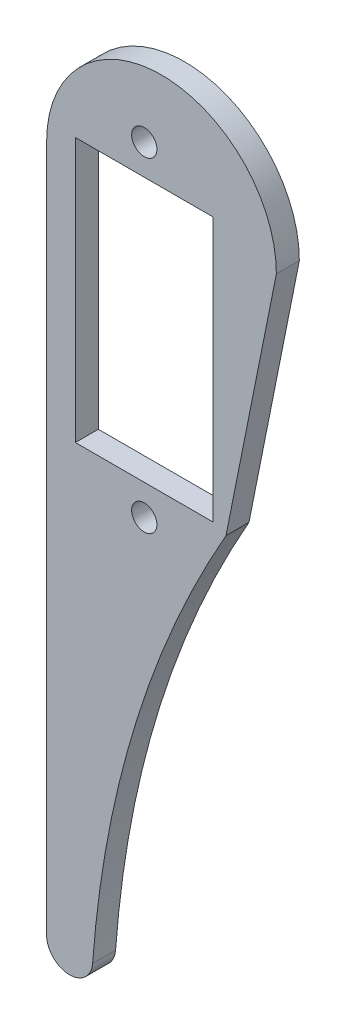
ISO-10303-21;
HEADER;
FILE_DESCRIPTION(('STEP AP214'),'2;1');
FILE_NAME('part.step','',(''),(''),'','','');
FILE_SCHEMA(('AUTOMOTIVE_DESIGN { 1 0 10303 214 1 1 1 1 }'));
ENDSEC;
DATA;
#1=APPLICATION_CONTEXT('core data for automotive mechanical design processes');
#2=APPLICATION_PROTOCOL_DEFINITION('international standard','automotive_design',2000,#1);
#3=PRODUCT_CONTEXT('',#1,'mechanical');
#4=PRODUCT('Part','Part','',(#3));
#5=PRODUCT_RELATED_PRODUCT_CATEGORY('part','',(#4));
#6=PRODUCT_DEFINITION_FORMATION('','',#4);
#7=PRODUCT_DEFINITION_CONTEXT('part definition',#1,'design');
#8=PRODUCT_DEFINITION('design','',#6,#7);
#9=PRODUCT_DEFINITION_SHAPE('','',#8);
#10=(LENGTH_UNIT() NAMED_UNIT(*) SI_UNIT(.MILLI.,.METRE.));
#11=(NAMED_UNIT(*) PLANE_ANGLE_UNIT() SI_UNIT($,.RADIAN.));
#12=(NAMED_UNIT(*) SI_UNIT($,.STERADIAN.) SOLID_ANGLE_UNIT());
#13=UNCERTAINTY_MEASURE_WITH_UNIT(LENGTH_MEASURE(1.E-05),#10,'distance_accuracy_value','');
#14=(GEOMETRIC_REPRESENTATION_CONTEXT(3) GLOBAL_UNCERTAINTY_ASSIGNED_CONTEXT((#13)) GLOBAL_UNIT_ASSIGNED_CONTEXT((#10,
#11,#12)) REPRESENTATION_CONTEXT('',''));
#15=CARTESIAN_POINT('',(0.,0.,0.));
#16=DIRECTION('',(0.,0.,1.));
#17=DIRECTION('',(1.,0.,0.));
#18=AXIS2_PLACEMENT_3D('',#15,#16,#17);
#19=CARTESIAN_POINT('',(8.21630615640599,2.32945091514143,2.));
#20=DIRECTION('',(0.,0.,-1.));
#21=DIRECTION('',(-1.,0.,0.));
#22=AXIS2_PLACEMENT_3D('',#19,#20,#21);
#23=CYLINDRICAL_SURFACE('',#22,10.);
#24=CARTESIAN_POINT('',(8.21630615640599,2.32945091514143,0.));
#25=DIRECTION('',(0.,0.,1.));
#26=DIRECTION('',(-1.,0.,0.));
#27=AXIS2_PLACEMENT_3D('',#24,#25,#26);
#28=CIRCLE('',#27,10.);
#29=CARTESIAN_POINT('',(18.216306156406,2.32945091514143,0.));
#30=VERTEX_POINT('',#29);
#31=CARTESIAN_POINT('',(-1.78369384359401,2.32945091514143,0.));
#32=VERTEX_POINT('',#31);
#33=EDGE_CURVE('E117',#30,#32,#28,.T.);
#34=ORIENTED_EDGE('',*,*,#33,.T.);
#35=DIRECTION('',(0.,0.,-1.));
#36=VECTOR('',#35,1.);
#37=CARTESIAN_POINT('',(-1.78369384359401,2.32945091514143,2.));
#38=LINE('',#37,#36);
#39=CARTESIAN_POINT('',(-1.78369384359401,2.32945091514143,2.));
#40=VERTEX_POINT('',#39);
#41=EDGE_CURVE('E11',#40,#32,#38,.T.);
#42=ORIENTED_EDGE('',*,*,#41,.F.);
#43=CARTESIAN_POINT('',(8.21630615640599,2.32945091514143,2.));
#44=DIRECTION('',(0.,0.,1.));
#45=DIRECTION('',(-1.,0.,0.));
#46=AXIS2_PLACEMENT_3D('',#43,#44,#45);
#47=CIRCLE('',#46,10.);
#48=CARTESIAN_POINT('',(18.216306156406,2.32945091514143,2.));
#49=VERTEX_POINT('',#48);
#50=EDGE_CURVE('E156',#49,#40,#47,.T.);
#51=ORIENTED_EDGE('',*,*,#50,.F.);
#52=DIRECTION('',(0.,0.,-1.));
#53=VECTOR('',#52,1.);
#54=CARTESIAN_POINT('',(18.216306156406,2.32945091514143,2.));
#55=LINE('',#54,#53);
#56=EDGE_CURVE('E226',#49,#30,#55,.T.);
#57=ORIENTED_EDGE('',*,*,#56,.T.);
#58=EDGE_LOOP('',(#34,#42,#51,#57));
#59=FACE_BOUND('',#58,.T.);
#60=ADVANCED_FACE('F39',(#59),#23,.T.);
#61=CARTESIAN_POINT('',(-1.78369384359401,2.32945091514143,2.));
#62=DIRECTION('',(1.,0.,0.));
#63=DIRECTION('',(0.,1.,0.));
#64=AXIS2_PLACEMENT_3D('',#61,#62,#63);
#65=PLANE('',#64);
#66=DIRECTION('',(0.,-1.,0.));
#67=VECTOR('',#66,1.);
#68=CARTESIAN_POINT('',(-1.78369384359401,2.32945091514143,0.));
#69=LINE('',#68,#67);
#70=CARTESIAN_POINT('',(-1.783693843594,-57.6705490848586,0.));
#71=VERTEX_POINT('',#70);
#72=EDGE_CURVE('E197',#32,#71,#69,.T.);
#73=ORIENTED_EDGE('',*,*,#72,.T.);
#74=DIRECTION('',(0.,0.,-1.));
#75=VECTOR('',#74,1.);
#76=CARTESIAN_POINT('',(-1.783693843594,-57.6705490848586,2.));
#77=LINE('',#76,#75);
#78=CARTESIAN_POINT('',(-1.783693843594,-57.6705490848586,2.));
#79=VERTEX_POINT('',#78);
#80=EDGE_CURVE('E47',#79,#71,#77,.T.);
#81=ORIENTED_EDGE('',*,*,#80,.F.);
#82=DIRECTION('',(0.,-1.,0.));
#83=VECTOR('',#82,1.);
#84=CARTESIAN_POINT('',(-1.78369384359401,2.32945091514143,2.));
#85=LINE('',#84,#83);
#86=EDGE_CURVE('E160',#40,#79,#85,.T.);
#87=ORIENTED_EDGE('',*,*,#86,.F.);
#88=ORIENTED_EDGE('',*,*,#41,.T.);
#89=EDGE_LOOP('',(#73,#81,#87,#88));
#90=FACE_BOUND('',#89,.T.);
#91=ADVANCED_FACE('F188',(#90),#65,.F.);
#92=CARTESIAN_POINT('',(0.216306156405997,-57.5217745207678,2.));
#93=DIRECTION('',(0.,0.,-1.));
#94=DIRECTION('',(-1.,0.,0.));
#95=AXIS2_PLACEMENT_3D('',#92,#93,#94);
#96=CYLINDRICAL_SURFACE('',#95,2.0055258340197);
#97=CARTESIAN_POINT('',(0.216306156405997,-57.5217745207678,0.));
#98=DIRECTION('',(0.,0.,1.));
#99=DIRECTION('',(-1.,0.,0.));
#100=AXIS2_PLACEMENT_3D('',#97,#98,#99);
#101=CIRCLE('',#100,2.0055258340197);
#102=CARTESIAN_POINT('',(2.216306156406,-57.6705490848586,0.));
#103=VERTEX_POINT('',#102);
#104=EDGE_CURVE('E205',#71,#103,#101,.T.);
#105=ORIENTED_EDGE('',*,*,#104,.T.);
#106=DIRECTION('',(0.,0.,-1.));
#107=VECTOR('',#106,1.);
#108=CARTESIAN_POINT('',(2.216306156406,-57.6705490848586,2.));
#109=LINE('',#108,#107);
#110=CARTESIAN_POINT('',(2.216306156406,-57.6705490848586,2.));
#111=VERTEX_POINT('',#110);
#112=EDGE_CURVE('E210',#111,#103,#109,.T.);
#113=ORIENTED_EDGE('',*,*,#112,.F.);
#114=CARTESIAN_POINT('',(0.216306156405997,-57.5217745207678,2.));
#115=DIRECTION('',(0.,0.,1.));
#116=DIRECTION('',(-1.,0.,0.));
#117=AXIS2_PLACEMENT_3D('',#114,#115,#116);
#118=CIRCLE('',#117,2.0055258340197);
#119=EDGE_CURVE('E164',#79,#111,#118,.T.);
#120=ORIENTED_EDGE('',*,*,#119,.F.);
#121=ORIENTED_EDGE('',*,*,#80,.T.);
#122=EDGE_LOOP('',(#105,#113,#120,#121));
#123=FACE_BOUND('',#122,.T.);
#124=ADVANCED_FACE('F184',(#123),#96,.T.);
#125=CARTESIAN_POINT('',(2.216306156406,-57.6705490848586,2.));
#126=CARTESIAN_POINT('',(3.2265957531882,-44.089066215707,2.));
#127=CARTESIAN_POINT('',(7.09762636747385,-31.4005798109446,2.));
#128=CARTESIAN_POINT('',(13.8293979992635,-19.6050898705712,2.));
#129=B_SPLINE_CURVE_WITH_KNOTS('',3,(#125,#126,#127,#128),.UNSPECIFIED.,.F.,.F.,(4,4),(0.,1.),.UNSPECIFIED.);
#130=DIRECTION('',(0.,0.,-1.));
#131=VECTOR('',#130,1.);
#132=SURFACE_OF_LINEAR_EXTRUSION('',#129,#131);
#133=CARTESIAN_POINT('',(2.216306156406,-57.6705490848586,0.));
#134=CARTESIAN_POINT('',(3.2265957531882,-44.089066215707,0.));
#135=CARTESIAN_POINT('',(7.09762636747385,-31.4005798109446,0.));
#136=CARTESIAN_POINT('',(13.8293979992635,-19.6050898705712,0.));
#137=B_SPLINE_CURVE_WITH_KNOTS('',3,(#133,#134,#135,#136),.UNSPECIFIED.,.F.,.F.,(4,4),(0.,1.),.UNSPECIFIED.);
#138=CARTESIAN_POINT('',(13.8293979992635,-19.6050898705712,0.));
#139=VERTEX_POINT('',#138);
#140=EDGE_CURVE('E213',#103,#139,#137,.T.);
#141=ORIENTED_EDGE('',*,*,#140,.T.);
#142=DIRECTION('',(0.,0.,-1.));
#143=VECTOR('',#142,1.);
#144=CARTESIAN_POINT('',(13.8293979992635,-19.6050898705712,2.));
#145=LINE('',#144,#143);
#146=CARTESIAN_POINT('',(13.8293979992635,-19.6050898705712,2.));
#147=VERTEX_POINT('',#146);
#148=EDGE_CURVE('E230',#147,#139,#145,.T.);
#149=ORIENTED_EDGE('',*,*,#148,.F.);
#150=EDGE_CURVE('E167',#111,#147,#129,.T.);
#151=ORIENTED_EDGE('',*,*,#150,.F.);
#152=ORIENTED_EDGE('',*,*,#112,.T.);
#153=EDGE_LOOP('',(#141,#149,#151,#152));
#154=FACE_BOUND('',#153,.T.);
#155=ADVANCED_FACE('F179',(#154),#132,.F.);
#156=CARTESIAN_POINT('',(18.216306156406,2.32945091514143,2.));
#157=DIRECTION('',(-0.98058067569092,0.196116135138184,0.));
#158=DIRECTION('',(-0.196116135138184,-0.98058067569092,0.));
#159=AXIS2_PLACEMENT_3D('',#156,#157,#158);
#160=PLANE('',#159);
#161=DIRECTION('',(0.196116135138184,0.98058067569092,0.));
#162=VECTOR('',#161,1.);
#163=CARTESIAN_POINT('',(18.216306156406,2.32945091514143,0.));
#164=LINE('',#163,#162);
#165=EDGE_CURVE('E161',#139,#30,#164,.T.);
#166=ORIENTED_EDGE('',*,*,#165,.T.);
#167=ORIENTED_EDGE('',*,*,#56,.F.);
#168=DIRECTION('',(0.196116135138184,0.98058067569092,0.));
#169=VECTOR('',#168,1.);
#170=CARTESIAN_POINT('',(18.216306156406,2.32945091514143,2.));
#171=LINE('',#170,#169);
#172=EDGE_CURVE('E173',#147,#49,#171,.T.);
#173=ORIENTED_EDGE('',*,*,#172,.F.);
#174=ORIENTED_EDGE('',*,*,#148,.T.);
#175=EDGE_LOOP('',(#166,#167,#173,#174));
#176=FACE_BOUND('',#175,.T.);
#177=ADVANCED_FACE('F183',(#176),#160,.F.);
#178=CARTESIAN_POINT('',(8.21630615640599,2.32945091514143,2.));
#179=DIRECTION('',(0.,0.,-1.));
#180=DIRECTION('',(-1.,0.,0.));
#181=AXIS2_PLACEMENT_3D('',#178,#179,#180);
#182=PLANE('',#181);
#183=CARTESIAN_POINT('',(6.716306156406,-21.7893999918604,2.));
#184=DIRECTION('',(0.,0.,1.));
#185=DIRECTION('',(1.,0.,0.));
#186=AXIS2_PLACEMENT_3D('',#183,#184,#185);
#187=CIRCLE('',#186,1.1);
#188=CARTESIAN_POINT('',(7.81630615640599,-21.7893999918604,2.));
#189=VERTEX_POINT('',#188);
#190=EDGE_CURVE('E290',#189,#189,#187,.T.);
#191=ORIENTED_EDGE('',*,*,#190,.F.);
#192=EDGE_LOOP('',(#191));
#193=FACE_BOUND('',#192,.T.);
#194=CARTESIAN_POINT('',(6.71630615640599,6.51060000813964,2.));
#195=DIRECTION('',(0.,0.,1.));
#196=DIRECTION('',(1.,0.,0.));
#197=AXIS2_PLACEMENT_3D('',#194,#195,#196);
#198=CIRCLE('',#197,1.1);
#199=CARTESIAN_POINT('',(7.81630615640599,6.51060000813964,2.));
#200=VERTEX_POINT('',#199);
#201=EDGE_CURVE('E285',#200,#200,#198,.T.);
#202=ORIENTED_EDGE('',*,*,#201,.F.);
#203=EDGE_LOOP('',(#202));
#204=FACE_BOUND('',#203,.T.);
#205=DIRECTION('',(1.,0.,0.));
#206=VECTOR('',#205,1.);
#207=CARTESIAN_POINT('',(0.716306156405993,-19.1393999918604,2.));
#208=LINE('',#207,#206);
#209=CARTESIAN_POINT('',(0.716306156405992,-19.1393999918604,2.));
#210=VERTEX_POINT('',#209);
#211=CARTESIAN_POINT('',(12.716306156406,-19.1393999918604,2.));
#212=VERTEX_POINT('',#211);
#213=EDGE_CURVE('E134',#210,#212,#208,.T.);
#214=ORIENTED_EDGE('',*,*,#213,.F.);
#215=DIRECTION('',(0.,-1.,0.));
#216=VECTOR('',#215,1.);
#217=CARTESIAN_POINT('',(0.71630615640599,3.86060000813964,2.));
#218=LINE('',#217,#216);
#219=CARTESIAN_POINT('',(0.71630615640599,3.86060000813964,2.));
#220=VERTEX_POINT('',#219);
#221=EDGE_CURVE('E54',#220,#210,#218,.T.);
#222=ORIENTED_EDGE('',*,*,#221,.F.);
#223=DIRECTION('',(-1.,0.,0.));
#224=VECTOR('',#223,1.);
#225=CARTESIAN_POINT('',(0.71630615640599,3.86060000813964,2.));
#226=LINE('',#225,#224);
#227=CARTESIAN_POINT('',(12.716306156406,3.86060000813964,2.));
#228=VERTEX_POINT('',#227);
#229=EDGE_CURVE('E124',#228,#220,#226,.T.);
#230=ORIENTED_EDGE('',*,*,#229,.F.);
#231=DIRECTION('',(0.,1.,0.));
#232=VECTOR('',#231,1.);
#233=CARTESIAN_POINT('',(12.716306156406,3.86060000813964,2.));
#234=LINE('',#233,#232);
#235=EDGE_CURVE('E142',#212,#228,#234,.T.);
#236=ORIENTED_EDGE('',*,*,#235,.F.);
#237=EDGE_LOOP('',(#214,#222,#230,#236));
#238=FACE_BOUND('',#237,.T.);
#239=ORIENTED_EDGE('',*,*,#50,.T.);
#240=ORIENTED_EDGE('',*,*,#86,.T.);
#241=ORIENTED_EDGE('',*,*,#119,.T.);
#242=ORIENTED_EDGE('',*,*,#150,.T.);
#243=ORIENTED_EDGE('',*,*,#172,.T.);
#244=EDGE_LOOP('',(#239,#240,#241,#242,#243));
#245=FACE_BOUND('',#244,.T.);
#246=ADVANCED_FACE('F239',(#193,#204,#238,#245),#182,.F.);
#247=CARTESIAN_POINT('',(8.21630615640599,2.32945091514143,0.));
#248=DIRECTION('',(0.,0.,-1.));
#249=DIRECTION('',(-1.,0.,0.));
#250=AXIS2_PLACEMENT_3D('',#247,#248,#249);
#251=PLANE('',#250);
#252=CARTESIAN_POINT('',(6.716306156406,-21.7893999918604,0.));
#253=DIRECTION('',(0.,0.,-1.));
#254=DIRECTION('',(-1.,0.,0.));
#255=AXIS2_PLACEMENT_3D('',#252,#253,#254);
#256=CIRCLE('',#255,1.1);
#257=CARTESIAN_POINT('',(5.616306156406,-21.7893999918604,0.));
#258=VERTEX_POINT('',#257);
#259=EDGE_CURVE('E296',#258,#258,#256,.F.);
#260=ORIENTED_EDGE('',*,*,#259,.T.);
#261=EDGE_LOOP('',(#260));
#262=FACE_BOUND('',#261,.T.);
#263=CARTESIAN_POINT('',(6.71630615640599,6.51060000813964,0.));
#264=DIRECTION('',(0.,0.,-1.));
#265=DIRECTION('',(-1.,0.,0.));
#266=AXIS2_PLACEMENT_3D('',#263,#264,#265);
#267=CIRCLE('',#266,1.1);
#268=CARTESIAN_POINT('',(5.61630615640599,6.51060000813964,0.));
#269=VERTEX_POINT('',#268);
#270=EDGE_CURVE('E282',#269,#269,#267,.F.);
#271=ORIENTED_EDGE('',*,*,#270,.T.);
#272=EDGE_LOOP('',(#271));
#273=FACE_BOUND('',#272,.T.);
#274=DIRECTION('',(0.,-1.,0.));
#275=VECTOR('',#274,1.);
#276=CARTESIAN_POINT('',(0.71630615640599,3.86060000813964,0.));
#277=LINE('',#276,#275);
#278=CARTESIAN_POINT('',(0.71630615640599,3.86060000813964,0.));
#279=VERTEX_POINT('',#278);
#280=CARTESIAN_POINT('',(0.716306156405993,-19.1393999918604,0.));
#281=VERTEX_POINT('',#280);
#282=EDGE_CURVE('E121',#279,#281,#277,.T.);
#283=ORIENTED_EDGE('',*,*,#282,.T.);
#284=DIRECTION('',(1.,0.,0.));
#285=VECTOR('',#284,1.);
#286=CARTESIAN_POINT('',(0.716306156405993,-19.1393999918604,0.));
#287=LINE('',#286,#285);
#288=CARTESIAN_POINT('',(12.716306156406,-19.1393999918604,0.));
#289=VERTEX_POINT('',#288);
#290=EDGE_CURVE('E109',#281,#289,#287,.T.);
#291=ORIENTED_EDGE('',*,*,#290,.T.);
#292=DIRECTION('',(0.,1.,0.));
#293=VECTOR('',#292,1.);
#294=CARTESIAN_POINT('',(12.716306156406,3.86060000813964,0.));
#295=LINE('',#294,#293);
#296=CARTESIAN_POINT('',(12.716306156406,3.86060000813964,0.));
#297=VERTEX_POINT('',#296);
#298=EDGE_CURVE('E136',#289,#297,#295,.T.);
#299=ORIENTED_EDGE('',*,*,#298,.T.);
#300=DIRECTION('',(-1.,0.,0.));
#301=VECTOR('',#300,1.);
#302=CARTESIAN_POINT('',(0.71630615640599,3.86060000813964,0.));
#303=LINE('',#302,#301);
#304=EDGE_CURVE('E129',#297,#279,#303,.T.);
#305=ORIENTED_EDGE('',*,*,#304,.T.);
#306=EDGE_LOOP('',(#283,#291,#299,#305));
#307=FACE_BOUND('',#306,.T.);
#308=ORIENTED_EDGE('',*,*,#33,.F.);
#309=ORIENTED_EDGE('',*,*,#165,.F.);
#310=ORIENTED_EDGE('',*,*,#140,.F.);
#311=ORIENTED_EDGE('',*,*,#104,.F.);
#312=ORIENTED_EDGE('',*,*,#72,.F.);
#313=EDGE_LOOP('',(#308,#309,#310,#311,#312));
#314=FACE_BOUND('',#313,.T.);
#315=ADVANCED_FACE('F127',(#262,#273,#307,#314),#251,.T.);
#316=CARTESIAN_POINT('',(0.71630615640599,3.86060000813964,-0.00100000000000013));
#317=DIRECTION('',(-1.,0.,0.));
#318=DIRECTION('',(0.,-1.,0.));
#319=AXIS2_PLACEMENT_3D('',#316,#317,#318);
#320=PLANE('',#319);
#321=DIRECTION('',(0.,0.,1.));
#322=VECTOR('',#321,1.);
#323=CARTESIAN_POINT('',(0.71630615640599,3.86060000813964,-0.00100000000000013));
#324=LINE('',#323,#322);
#325=EDGE_CURVE('E118',#279,#220,#324,.T.);
#326=ORIENTED_EDGE('',*,*,#325,.T.);
#327=ORIENTED_EDGE('',*,*,#221,.T.);
#328=DIRECTION('',(0.,0.,1.));
#329=VECTOR('',#328,1.);
#330=CARTESIAN_POINT('',(0.716306156405993,-19.1393999918604,-0.00100000000000013));
#331=LINE('',#330,#329);
#332=EDGE_CURVE('E111',#281,#210,#331,.T.);
#333=ORIENTED_EDGE('',*,*,#332,.F.);
#334=ORIENTED_EDGE('',*,*,#282,.F.);
#335=EDGE_LOOP('',(#326,#327,#333,#334));
#336=FACE_BOUND('',#335,.T.);
#337=ADVANCED_FACE('F120',(#336),#320,.F.);
#338=CARTESIAN_POINT('',(0.71630615640599,3.86060000813964,-0.00100000000000013));
#339=DIRECTION('',(0.,1.,0.));
#340=DIRECTION('',(0.,0.,1.));
#341=AXIS2_PLACEMENT_3D('',#338,#339,#340);
#342=PLANE('',#341);
#343=DIRECTION('',(0.,0.,1.));
#344=VECTOR('',#343,1.);
#345=CARTESIAN_POINT('',(12.716306156406,3.86060000813964,-0.00100000000000013));
#346=LINE('',#345,#344);
#347=EDGE_CURVE('E151',#297,#228,#346,.T.);
#348=ORIENTED_EDGE('',*,*,#347,.T.);
#349=ORIENTED_EDGE('',*,*,#229,.T.);
#350=ORIENTED_EDGE('',*,*,#325,.F.);
#351=ORIENTED_EDGE('',*,*,#304,.F.);
#352=EDGE_LOOP('',(#348,#349,#350,#351));
#353=FACE_BOUND('',#352,.T.);
#354=ADVANCED_FACE('F260',(#353),#342,.F.);
#355=CARTESIAN_POINT('',(12.716306156406,3.86060000813964,-0.00100000000000013));
#356=DIRECTION('',(1.,0.,0.));
#357=DIRECTION('',(0.,1.,0.));
#358=AXIS2_PLACEMENT_3D('',#355,#356,#357);
#359=PLANE('',#358);
#360=DIRECTION('',(0.,0.,1.));
#361=VECTOR('',#360,1.);
#362=CARTESIAN_POINT('',(12.716306156406,-19.1393999918604,-0.00100000000000013));
#363=LINE('',#362,#361);
#364=EDGE_CURVE('E62',#289,#212,#363,.T.);
#365=ORIENTED_EDGE('',*,*,#364,.T.);
#366=ORIENTED_EDGE('',*,*,#235,.T.);
#367=ORIENTED_EDGE('',*,*,#347,.F.);
#368=ORIENTED_EDGE('',*,*,#298,.F.);
#369=EDGE_LOOP('',(#365,#366,#367,#368));
#370=FACE_BOUND('',#369,.T.);
#371=ADVANCED_FACE('F264',(#370),#359,.F.);
#372=CARTESIAN_POINT('',(0.716306156405993,-19.1393999918604,-0.00100000000000013));
#373=DIRECTION('',(0.,-1.,0.));
#374=DIRECTION('',(0.,0.,-1.));
#375=AXIS2_PLACEMENT_3D('',#372,#373,#374);
#376=PLANE('',#375);
#377=ORIENTED_EDGE('',*,*,#332,.T.);
#378=ORIENTED_EDGE('',*,*,#213,.T.);
#379=ORIENTED_EDGE('',*,*,#364,.F.);
#380=ORIENTED_EDGE('',*,*,#290,.F.);
#381=EDGE_LOOP('',(#377,#378,#379,#380));
#382=FACE_BOUND('',#381,.T.);
#383=ADVANCED_FACE('F110',(#382),#376,.F.);
#384=CARTESIAN_POINT('',(6.71630615640599,6.51060000813964,-0.00100000000000013));
#385=DIRECTION('',(0.,0.,1.));
#386=DIRECTION('',(1.,0.,0.));
#387=AXIS2_PLACEMENT_3D('',#384,#385,#386);
#388=CYLINDRICAL_SURFACE('',#387,1.1);
#389=ORIENTED_EDGE('',*,*,#270,.F.);
#390=EDGE_LOOP('',(#389));
#391=FACE_BOUND('',#390,.T.);
#392=ORIENTED_EDGE('',*,*,#201,.T.);
#393=EDGE_LOOP('',(#392));
#394=FACE_BOUND('',#393,.T.);
#395=ADVANCED_FACE('F263',(#391,#394),#388,.F.);
#396=CARTESIAN_POINT('',(6.716306156406,-21.7893999918604,-0.00100000000000013));
#397=DIRECTION('',(0.,0.,1.));
#398=DIRECTION('',(1.,0.,0.));
#399=AXIS2_PLACEMENT_3D('',#396,#397,#398);
#400=CYLINDRICAL_SURFACE('',#399,1.1);
#401=ORIENTED_EDGE('',*,*,#259,.F.);
#402=EDGE_LOOP('',(#401));
#403=FACE_BOUND('',#402,.T.);
#404=ORIENTED_EDGE('',*,*,#190,.T.);
#405=EDGE_LOOP('',(#404));
#406=FACE_BOUND('',#405,.T.);
#407=ADVANCED_FACE('F271',(#403,#406),#400,.F.);
#408=CLOSED_SHELL('',(#60,#91,#124,#155,#177,#246,#315,#337,#354,#371,#383,#395,#407));
#409=MANIFOLD_SOLID_BREP('B2',#408);
#410=ADVANCED_BREP_SHAPE_REPRESENTATION('',(#18,#409),#14);
#411=SHAPE_DEFINITION_REPRESENTATION(#9,#410);
ENDSEC;
END-ISO-10303-21;
